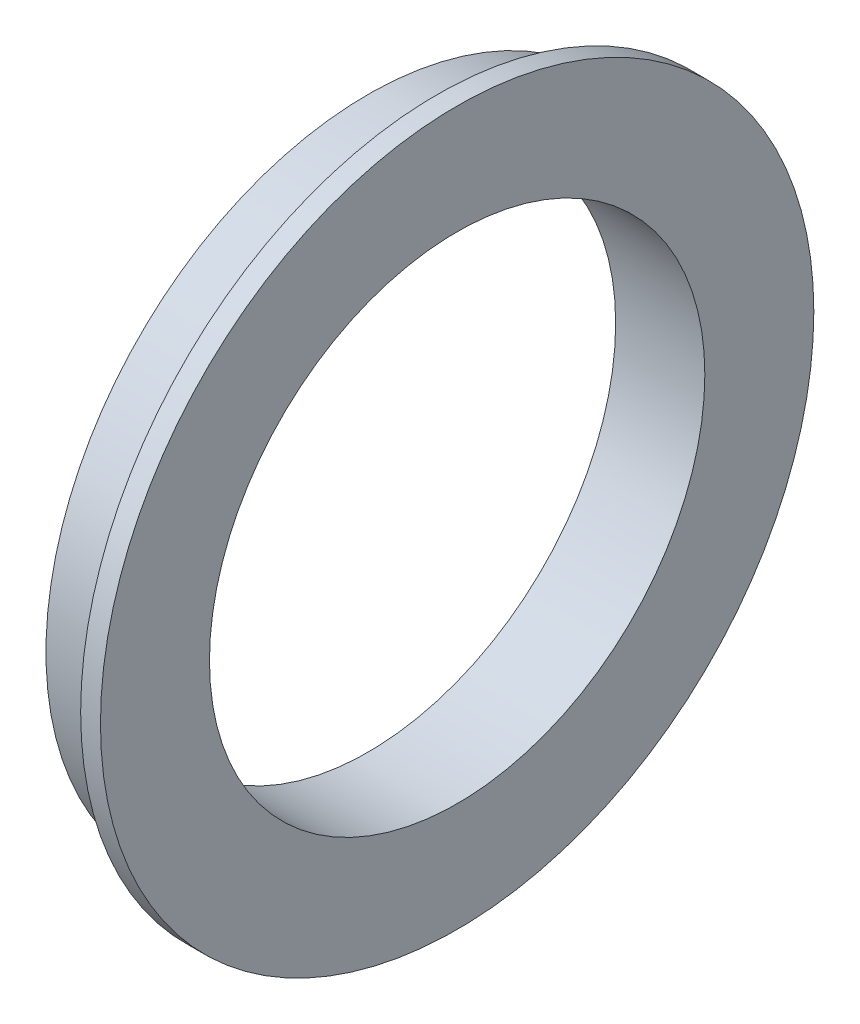
ISO-10303-21;
HEADER;
FILE_DESCRIPTION(('STEP AP214'),'2;1');
FILE_NAME('part.step','',(''),(''),'','','');
FILE_SCHEMA(('AUTOMOTIVE_DESIGN { 1 0 10303 214 1 1 1 1 }'));
ENDSEC;
DATA;
#1=APPLICATION_CONTEXT('core data for automotive mechanical design processes');
#2=APPLICATION_PROTOCOL_DEFINITION('international standard','automotive_design',2000,#1);
#3=PRODUCT_CONTEXT('',#1,'mechanical');
#4=PRODUCT('Part','Part','',(#3));
#5=PRODUCT_RELATED_PRODUCT_CATEGORY('part','',(#4));
#6=PRODUCT_DEFINITION_FORMATION('','',#4);
#7=PRODUCT_DEFINITION_CONTEXT('part definition',#1,'design');
#8=PRODUCT_DEFINITION('design','',#6,#7);
#9=PRODUCT_DEFINITION_SHAPE('','',#8);
#10=(LENGTH_UNIT() NAMED_UNIT(*) SI_UNIT(.MILLI.,.METRE.));
#11=(NAMED_UNIT(*) PLANE_ANGLE_UNIT() SI_UNIT($,.RADIAN.));
#12=(NAMED_UNIT(*) SI_UNIT($,.STERADIAN.) SOLID_ANGLE_UNIT());
#13=UNCERTAINTY_MEASURE_WITH_UNIT(LENGTH_MEASURE(1.E-05),#10,'distance_accuracy_value','');
#14=(GEOMETRIC_REPRESENTATION_CONTEXT(3) GLOBAL_UNCERTAINTY_ASSIGNED_CONTEXT((#13)) GLOBAL_UNIT_ASSIGNED_CONTEXT((#10,
#11,#12)) REPRESENTATION_CONTEXT('',''));
#15=CARTESIAN_POINT('',(0.,0.,0.));
#16=DIRECTION('',(0.,0.,1.));
#17=DIRECTION('',(1.,0.,0.));
#18=AXIS2_PLACEMENT_3D('',#15,#16,#17);
#19=CARTESIAN_POINT('',(0.,0.,0.));
#20=DIRECTION('',(1.,0.,0.));
#21=DIRECTION('',(0.,0.,-1.));
#22=AXIS2_PLACEMENT_3D('',#19,#20,#21);
#23=PLANE('',#22);
#24=CARTESIAN_POINT('',(0.,0.,0.));
#25=DIRECTION('',(1.,0.,0.));
#26=DIRECTION('',(0.,0.,-1.));
#27=AXIS2_PLACEMENT_3D('',#24,#25,#26);
#28=CIRCLE('',#27,32.5);
#29=CARTESIAN_POINT('',(0.,0.,-32.5));
#30=VERTEX_POINT('',#29);
#31=EDGE_CURVE('E47',#30,#30,#28,.T.);
#32=ORIENTED_EDGE('',*,*,#31,.F.);
#33=EDGE_LOOP('',(#32));
#34=FACE_BOUND('',#33,.T.);
#35=CARTESIAN_POINT('',(0.,0.,0.));
#36=DIRECTION('',(1.,0.,0.));
#37=DIRECTION('',(0.,0.,-1.));
#38=AXIS2_PLACEMENT_3D('',#35,#36,#37);
#39=CIRCLE('',#38,25.);
#40=CARTESIAN_POINT('',(0.,0.,-25.));
#41=VERTEX_POINT('',#40);
#42=EDGE_CURVE('E56',#41,#41,#39,.T.);
#43=ORIENTED_EDGE('',*,*,#42,.T.);
#44=EDGE_LOOP('',(#43));
#45=FACE_BOUND('',#44,.T.);
#46=ADVANCED_FACE('F43',(#34,#45),#23,.F.);
#47=CARTESIAN_POINT('',(7.,0.,0.));
#48=DIRECTION('',(-1.,0.,0.));
#49=DIRECTION('',(0.,0.,1.));
#50=AXIS2_PLACEMENT_3D('',#47,#48,#49);
#51=CYLINDRICAL_SURFACE('',#50,32.5);
#52=CARTESIAN_POINT('',(7.,0.,0.));
#53=DIRECTION('',(1.,0.,0.));
#54=DIRECTION('',(0.,0.,-1.));
#55=AXIS2_PLACEMENT_3D('',#52,#53,#54);
#56=CIRCLE('',#55,32.5);
#57=CARTESIAN_POINT('',(7.,0.,-32.5));
#58=VERTEX_POINT('',#57);
#59=EDGE_CURVE('E10',#58,#58,#56,.T.);
#60=ORIENTED_EDGE('',*,*,#59,.F.);
#61=EDGE_LOOP('',(#60));
#62=FACE_BOUND('',#61,.T.);
#63=ORIENTED_EDGE('',*,*,#31,.T.);
#64=EDGE_LOOP('',(#63));
#65=FACE_BOUND('',#64,.T.);
#66=ADVANCED_FACE('F45',(#62,#65),#51,.T.);
#67=CARTESIAN_POINT('',(7.,0.,0.));
#68=DIRECTION('',(-1.,0.,0.));
#69=DIRECTION('',(0.,0.,1.));
#70=AXIS2_PLACEMENT_3D('',#67,#68,#69);
#71=CYLINDRICAL_SURFACE('',#70,25.);
#72=ORIENTED_EDGE('',*,*,#42,.F.);
#73=EDGE_LOOP('',(#72));
#74=FACE_BOUND('',#73,.T.);
#75=CARTESIAN_POINT('',(9.,0.,0.));
#76=DIRECTION('',(1.,0.,0.));
#77=DIRECTION('',(0.,0.,-1.));
#78=AXIS2_PLACEMENT_3D('',#75,#76,#77);
#79=CIRCLE('',#78,25.);
#80=CARTESIAN_POINT('',(9.,0.,-25.));
#81=VERTEX_POINT('',#80);
#82=EDGE_CURVE('E66',#81,#81,#79,.T.);
#83=ORIENTED_EDGE('',*,*,#82,.T.);
#84=EDGE_LOOP('',(#83));
#85=FACE_BOUND('',#84,.T.);
#86=ADVANCED_FACE('F74',(#74,#85),#71,.F.);
#87=CARTESIAN_POINT('',(9.,0.,0.));
#88=DIRECTION('',(1.,0.,0.));
#89=DIRECTION('',(0.,0.,-1.));
#90=AXIS2_PLACEMENT_3D('',#87,#88,#89);
#91=PLANE('',#90);
#92=CARTESIAN_POINT('',(9.,0.,0.));
#93=DIRECTION('',(1.,0.,0.));
#94=DIRECTION('',(0.,0.,-1.));
#95=AXIS2_PLACEMENT_3D('',#92,#93,#94);
#96=CIRCLE('',#95,36.);
#97=CARTESIAN_POINT('',(9.,0.,-36.));
#98=VERTEX_POINT('',#97);
#99=EDGE_CURVE('E61',#98,#98,#96,.T.);
#100=ORIENTED_EDGE('',*,*,#99,.T.);
#101=EDGE_LOOP('',(#100));
#102=FACE_BOUND('',#101,.T.);
#103=ORIENTED_EDGE('',*,*,#82,.F.);
#104=EDGE_LOOP('',(#103));
#105=FACE_BOUND('',#104,.T.);
#106=ADVANCED_FACE('F76',(#102,#105),#91,.T.);
#107=CARTESIAN_POINT('',(7.,0.,0.));
#108=DIRECTION('',(1.,0.,0.));
#109=DIRECTION('',(0.,0.,-1.));
#110=AXIS2_PLACEMENT_3D('',#107,#108,#109);
#111=PLANE('',#110);
#112=ORIENTED_EDGE('',*,*,#59,.T.);
#113=EDGE_LOOP('',(#112));
#114=FACE_BOUND('',#113,.T.);
#115=CARTESIAN_POINT('',(7.,0.,0.));
#116=DIRECTION('',(1.,0.,0.));
#117=DIRECTION('',(0.,0.,-1.));
#118=AXIS2_PLACEMENT_3D('',#115,#116,#117);
#119=CIRCLE('',#118,36.);
#120=CARTESIAN_POINT('',(7.,0.,-36.));
#121=VERTEX_POINT('',#120);
#122=EDGE_CURVE('E62',#121,#121,#119,.T.);
#123=ORIENTED_EDGE('',*,*,#122,.F.);
#124=EDGE_LOOP('',(#123));
#125=FACE_BOUND('',#124,.T.);
#126=ADVANCED_FACE('F78',(#114,#125),#111,.F.);
#127=CARTESIAN_POINT('',(9.,0.,0.));
#128=DIRECTION('',(-1.,0.,0.));
#129=DIRECTION('',(0.,0.,1.));
#130=AXIS2_PLACEMENT_3D('',#127,#128,#129);
#131=CYLINDRICAL_SURFACE('',#130,36.);
#132=ORIENTED_EDGE('',*,*,#99,.F.);
#133=EDGE_LOOP('',(#132));
#134=FACE_BOUND('',#133,.T.);
#135=ORIENTED_EDGE('',*,*,#122,.T.);
#136=EDGE_LOOP('',(#135));
#137=FACE_BOUND('',#136,.T.);
#138=ADVANCED_FACE('F85',(#134,#137),#131,.T.);
#139=CLOSED_SHELL('',(#46,#66,#86,#106,#126,#138));
#140=MANIFOLD_SOLID_BREP('B2',#139);
#141=ADVANCED_BREP_SHAPE_REPRESENTATION('',(#18,#140),#14);
#142=SHAPE_DEFINITION_REPRESENTATION(#9,#141);
ENDSEC;
END-ISO-10303-21;
